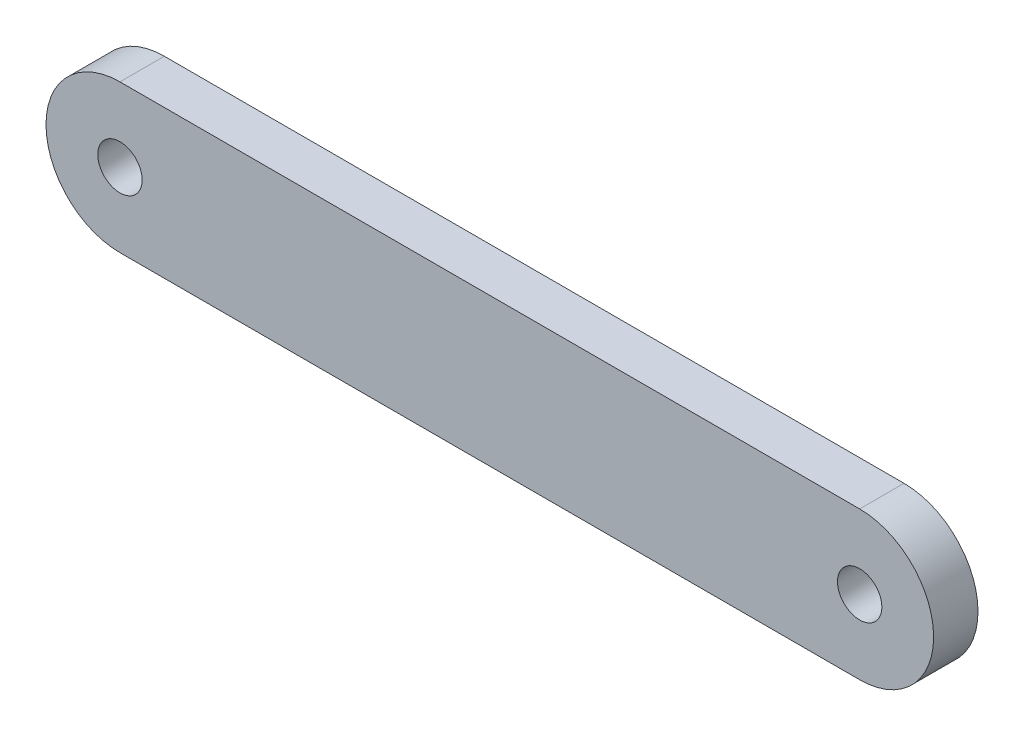
ISO-10303-21;
HEADER;
FILE_DESCRIPTION(('STEP AP214'),'2;1');
FILE_NAME('part.step','',(''),(''),'','','');
FILE_SCHEMA(('AUTOMOTIVE_DESIGN { 1 0 10303 214 1 1 1 1 }'));
ENDSEC;
DATA;
#1=APPLICATION_CONTEXT('core data for automotive mechanical design processes');
#2=APPLICATION_PROTOCOL_DEFINITION('international standard','automotive_design',2000,#1);
#3=PRODUCT_CONTEXT('',#1,'mechanical');
#4=PRODUCT('Part','Part','',(#3));
#5=PRODUCT_RELATED_PRODUCT_CATEGORY('part','',(#4));
#6=PRODUCT_DEFINITION_FORMATION('','',#4);
#7=PRODUCT_DEFINITION_CONTEXT('part definition',#1,'design');
#8=PRODUCT_DEFINITION('design','',#6,#7);
#9=PRODUCT_DEFINITION_SHAPE('','',#8);
#10=(LENGTH_UNIT() NAMED_UNIT(*) SI_UNIT(.MILLI.,.METRE.));
#11=(NAMED_UNIT(*) PLANE_ANGLE_UNIT() SI_UNIT($,.RADIAN.));
#12=(NAMED_UNIT(*) SI_UNIT($,.STERADIAN.) SOLID_ANGLE_UNIT());
#13=UNCERTAINTY_MEASURE_WITH_UNIT(LENGTH_MEASURE(1.E-05),#10,'distance_accuracy_value','');
#14=(GEOMETRIC_REPRESENTATION_CONTEXT(3) GLOBAL_UNCERTAINTY_ASSIGNED_CONTEXT((#13)) GLOBAL_UNIT_ASSIGNED_CONTEXT((#10,
#11,#12)) REPRESENTATION_CONTEXT('',''));
#15=CARTESIAN_POINT('',(0.,0.,0.));
#16=DIRECTION('',(0.,0.,1.));
#17=DIRECTION('',(1.,0.,0.));
#18=AXIS2_PLACEMENT_3D('',#15,#16,#17);
#19=CARTESIAN_POINT('',(0.,0.,3.));
#20=DIRECTION('',(0.,0.,1.));
#21=DIRECTION('',(1.,0.,0.));
#22=AXIS2_PLACEMENT_3D('',#19,#20,#21);
#23=PLANE('',#22);
#24=CARTESIAN_POINT('',(0.,0.,3.));
#25=DIRECTION('',(0.,0.,1.));
#26=DIRECTION('',(1.,0.,0.));
#27=AXIS2_PLACEMENT_3D('',#24,#25,#26);
#28=CIRCLE('',#27,1.5);
#29=CARTESIAN_POINT('',(1.5,0.,3.));
#30=VERTEX_POINT('',#29);
#31=EDGE_CURVE('E106',#30,#30,#28,.T.);
#32=ORIENTED_EDGE('',*,*,#31,.F.);
#33=EDGE_LOOP('',(#32));
#34=FACE_BOUND('',#33,.T.);
#35=CARTESIAN_POINT('',(0.,0.,3.));
#36=DIRECTION('',(0.,0.,1.));
#37=DIRECTION('',(1.,0.,0.));
#38=AXIS2_PLACEMENT_3D('',#35,#36,#37);
#39=CIRCLE('',#38,5.);
#40=CARTESIAN_POINT('',(0.,5.,3.));
#41=VERTEX_POINT('',#40);
#42=CARTESIAN_POINT('',(0.,-5.,3.));
#43=VERTEX_POINT('',#42);
#44=EDGE_CURVE('E91',#41,#43,#39,.T.);
#45=ORIENTED_EDGE('',*,*,#44,.T.);
#46=DIRECTION('',(1.,0.,0.));
#47=VECTOR('',#46,1.);
#48=CARTESIAN_POINT('',(0.,-5.,3.));
#49=LINE('',#48,#47);
#50=CARTESIAN_POINT('',(50.,-5.,3.));
#51=VERTEX_POINT('',#50);
#52=EDGE_CURVE('E86',#43,#51,#49,.T.);
#53=ORIENTED_EDGE('',*,*,#52,.T.);
#54=CARTESIAN_POINT('',(50.,0.,3.));
#55=DIRECTION('',(0.,0.,1.));
#56=DIRECTION('',(1.,0.,0.));
#57=AXIS2_PLACEMENT_3D('',#54,#55,#56);
#58=CIRCLE('',#57,5.);
#59=CARTESIAN_POINT('',(50.,5.,3.));
#60=VERTEX_POINT('',#59);
#61=EDGE_CURVE('E89',#51,#60,#58,.T.);
#62=ORIENTED_EDGE('',*,*,#61,.T.);
#63=DIRECTION('',(-1.,0.,0.));
#64=VECTOR('',#63,1.);
#65=CARTESIAN_POINT('',(0.,5.,3.));
#66=LINE('',#65,#64);
#67=EDGE_CURVE('E56',#60,#41,#66,.T.);
#68=ORIENTED_EDGE('',*,*,#67,.T.);
#69=EDGE_LOOP('',(#45,#53,#62,#68));
#70=FACE_BOUND('',#69,.T.);
#71=CARTESIAN_POINT('',(50.,0.,3.));
#72=DIRECTION('',(0.,0.,1.));
#73=DIRECTION('',(1.,0.,0.));
#74=AXIS2_PLACEMENT_3D('',#71,#72,#73);
#75=CIRCLE('',#74,1.5);
#76=CARTESIAN_POINT('',(51.5,0.,3.));
#77=VERTEX_POINT('',#76);
#78=EDGE_CURVE('E121',#77,#77,#75,.T.);
#79=ORIENTED_EDGE('',*,*,#78,.F.);
#80=EDGE_LOOP('',(#79));
#81=FACE_BOUND('',#80,.T.);
#82=ADVANCED_FACE('F39',(#34,#70,#81),#23,.T.);
#83=CARTESIAN_POINT('',(0.,0.,0.));
#84=DIRECTION('',(0.,0.,1.));
#85=DIRECTION('',(1.,0.,0.));
#86=AXIS2_PLACEMENT_3D('',#83,#84,#85);
#87=PLANE('',#86);
#88=CARTESIAN_POINT('',(0.,0.,0.));
#89=DIRECTION('',(0.,0.,1.));
#90=DIRECTION('',(1.,0.,0.));
#91=AXIS2_PLACEMENT_3D('',#88,#89,#90);
#92=CIRCLE('',#91,5.);
#93=CARTESIAN_POINT('',(0.,5.,0.));
#94=VERTEX_POINT('',#93);
#95=CARTESIAN_POINT('',(0.,-5.,0.));
#96=VERTEX_POINT('',#95);
#97=EDGE_CURVE('E103',#94,#96,#92,.T.);
#98=ORIENTED_EDGE('',*,*,#97,.F.);
#99=DIRECTION('',(-1.,0.,0.));
#100=VECTOR('',#99,1.);
#101=CARTESIAN_POINT('',(0.,5.,0.));
#102=LINE('',#101,#100);
#103=CARTESIAN_POINT('',(50.,5.,0.));
#104=VERTEX_POINT('',#103);
#105=EDGE_CURVE('E79',#104,#94,#102,.T.);
#106=ORIENTED_EDGE('',*,*,#105,.F.);
#107=CARTESIAN_POINT('',(50.,0.,0.));
#108=DIRECTION('',(0.,0.,1.));
#109=DIRECTION('',(1.,0.,0.));
#110=AXIS2_PLACEMENT_3D('',#107,#108,#109);
#111=CIRCLE('',#110,5.);
#112=CARTESIAN_POINT('',(50.,-5.,0.));
#113=VERTEX_POINT('',#112);
#114=EDGE_CURVE('E73',#113,#104,#111,.T.);
#115=ORIENTED_EDGE('',*,*,#114,.F.);
#116=DIRECTION('',(1.,0.,0.));
#117=VECTOR('',#116,1.);
#118=CARTESIAN_POINT('',(0.,-5.,0.));
#119=LINE('',#118,#117);
#120=EDGE_CURVE('E95',#96,#113,#119,.T.);
#121=ORIENTED_EDGE('',*,*,#120,.F.);
#122=EDGE_LOOP('',(#98,#106,#115,#121));
#123=FACE_BOUND('',#122,.T.);
#124=CARTESIAN_POINT('',(0.,0.,0.));
#125=DIRECTION('',(0.,0.,1.));
#126=DIRECTION('',(1.,0.,0.));
#127=AXIS2_PLACEMENT_3D('',#124,#125,#126);
#128=CIRCLE('',#127,1.5);
#129=CARTESIAN_POINT('',(1.5,0.,0.));
#130=VERTEX_POINT('',#129);
#131=EDGE_CURVE('E118',#130,#130,#128,.T.);
#132=ORIENTED_EDGE('',*,*,#131,.T.);
#133=EDGE_LOOP('',(#132));
#134=FACE_BOUND('',#133,.T.);
#135=CARTESIAN_POINT('',(50.,0.,0.));
#136=DIRECTION('',(0.,0.,1.));
#137=DIRECTION('',(1.,0.,0.));
#138=AXIS2_PLACEMENT_3D('',#135,#136,#137);
#139=CIRCLE('',#138,1.5);
#140=CARTESIAN_POINT('',(51.5,0.,0.));
#141=VERTEX_POINT('',#140);
#142=EDGE_CURVE('E124',#141,#141,#139,.T.);
#143=ORIENTED_EDGE('',*,*,#142,.T.);
#144=EDGE_LOOP('',(#143));
#145=FACE_BOUND('',#144,.T.);
#146=ADVANCED_FACE('F114',(#123,#134,#145),#87,.F.);
#147=CARTESIAN_POINT('',(0.,0.,3.));
#148=DIRECTION('',(0.,0.,-1.));
#149=DIRECTION('',(-1.,0.,0.));
#150=AXIS2_PLACEMENT_3D('',#147,#148,#149);
#151=CYLINDRICAL_SURFACE('',#150,5.);
#152=ORIENTED_EDGE('',*,*,#97,.T.);
#153=DIRECTION('',(0.,0.,-1.));
#154=VECTOR('',#153,1.);
#155=CARTESIAN_POINT('',(0.,-5.,3.));
#156=LINE('',#155,#154);
#157=EDGE_CURVE('E11',#43,#96,#156,.T.);
#158=ORIENTED_EDGE('',*,*,#157,.F.);
#159=ORIENTED_EDGE('',*,*,#44,.F.);
#160=DIRECTION('',(0.,0.,-1.));
#161=VECTOR('',#160,1.);
#162=CARTESIAN_POINT('',(0.,5.,3.));
#163=LINE('',#162,#161);
#164=EDGE_CURVE('E99',#41,#94,#163,.T.);
#165=ORIENTED_EDGE('',*,*,#164,.T.);
#166=EDGE_LOOP('',(#152,#158,#159,#165));
#167=FACE_BOUND('',#166,.T.);
#168=ADVANCED_FACE('F41',(#167),#151,.T.);
#169=CARTESIAN_POINT('',(0.,-5.,3.));
#170=DIRECTION('',(0.,1.,0.));
#171=DIRECTION('',(-1.,0.,0.));
#172=AXIS2_PLACEMENT_3D('',#169,#170,#171);
#173=PLANE('',#172);
#174=ORIENTED_EDGE('',*,*,#120,.T.);
#175=DIRECTION('',(0.,0.,-1.));
#176=VECTOR('',#175,1.);
#177=CARTESIAN_POINT('',(50.,-5.,3.));
#178=LINE('',#177,#176);
#179=EDGE_CURVE('E48',#51,#113,#178,.T.);
#180=ORIENTED_EDGE('',*,*,#179,.F.);
#181=ORIENTED_EDGE('',*,*,#52,.F.);
#182=ORIENTED_EDGE('',*,*,#157,.T.);
#183=EDGE_LOOP('',(#174,#180,#181,#182));
#184=FACE_BOUND('',#183,.T.);
#185=ADVANCED_FACE('F94',(#184),#173,.F.);
#186=CARTESIAN_POINT('',(50.,0.,3.));
#187=DIRECTION('',(0.,0.,-1.));
#188=DIRECTION('',(-1.,0.,0.));
#189=AXIS2_PLACEMENT_3D('',#186,#187,#188);
#190=CYLINDRICAL_SURFACE('',#189,5.);
#191=ORIENTED_EDGE('',*,*,#114,.T.);
#192=DIRECTION('',(0.,0.,-1.));
#193=VECTOR('',#192,1.);
#194=CARTESIAN_POINT('',(50.,5.,3.));
#195=LINE('',#194,#193);
#196=EDGE_CURVE('E96',#60,#104,#195,.T.);
#197=ORIENTED_EDGE('',*,*,#196,.F.);
#198=ORIENTED_EDGE('',*,*,#61,.F.);
#199=ORIENTED_EDGE('',*,*,#179,.T.);
#200=EDGE_LOOP('',(#191,#197,#198,#199));
#201=FACE_BOUND('',#200,.T.);
#202=ADVANCED_FACE('F97',(#201),#190,.T.);
#203=CARTESIAN_POINT('',(0.,5.,3.));
#204=DIRECTION('',(0.,-1.,0.));
#205=DIRECTION('',(1.,0.,0.));
#206=AXIS2_PLACEMENT_3D('',#203,#204,#205);
#207=PLANE('',#206);
#208=ORIENTED_EDGE('',*,*,#105,.T.);
#209=ORIENTED_EDGE('',*,*,#164,.F.);
#210=ORIENTED_EDGE('',*,*,#67,.F.);
#211=ORIENTED_EDGE('',*,*,#196,.T.);
#212=EDGE_LOOP('',(#208,#209,#210,#211));
#213=FACE_BOUND('',#212,.T.);
#214=ADVANCED_FACE('F111',(#213),#207,.F.);
#215=CARTESIAN_POINT('',(0.,0.,3.));
#216=DIRECTION('',(0.,0.,-1.));
#217=DIRECTION('',(-1.,0.,0.));
#218=AXIS2_PLACEMENT_3D('',#215,#216,#217);
#219=CYLINDRICAL_SURFACE('',#218,1.5);
#220=ORIENTED_EDGE('',*,*,#31,.T.);
#221=EDGE_LOOP('',(#220));
#222=FACE_BOUND('',#221,.T.);
#223=ORIENTED_EDGE('',*,*,#131,.F.);
#224=EDGE_LOOP('',(#223));
#225=FACE_BOUND('',#224,.T.);
#226=ADVANCED_FACE('F141',(#222,#225),#219,.F.);
#227=CARTESIAN_POINT('',(50.,0.,3.));
#228=DIRECTION('',(0.,0.,-1.));
#229=DIRECTION('',(-1.,0.,0.));
#230=AXIS2_PLACEMENT_3D('',#227,#228,#229);
#231=CYLINDRICAL_SURFACE('',#230,1.5);
#232=ORIENTED_EDGE('',*,*,#78,.T.);
#233=EDGE_LOOP('',(#232));
#234=FACE_BOUND('',#233,.T.);
#235=ORIENTED_EDGE('',*,*,#142,.F.);
#236=EDGE_LOOP('',(#235));
#237=FACE_BOUND('',#236,.T.);
#238=ADVANCED_FACE('F130',(#234,#237),#231,.F.);
#239=CLOSED_SHELL('',(#82,#146,#168,#185,#202,#214,#226,#238));
#240=MANIFOLD_SOLID_BREP('B2',#239);
#241=ADVANCED_BREP_SHAPE_REPRESENTATION('',(#18,#240),#14);
#242=SHAPE_DEFINITION_REPRESENTATION(#9,#241);
ENDSEC;
END-ISO-10303-21;
